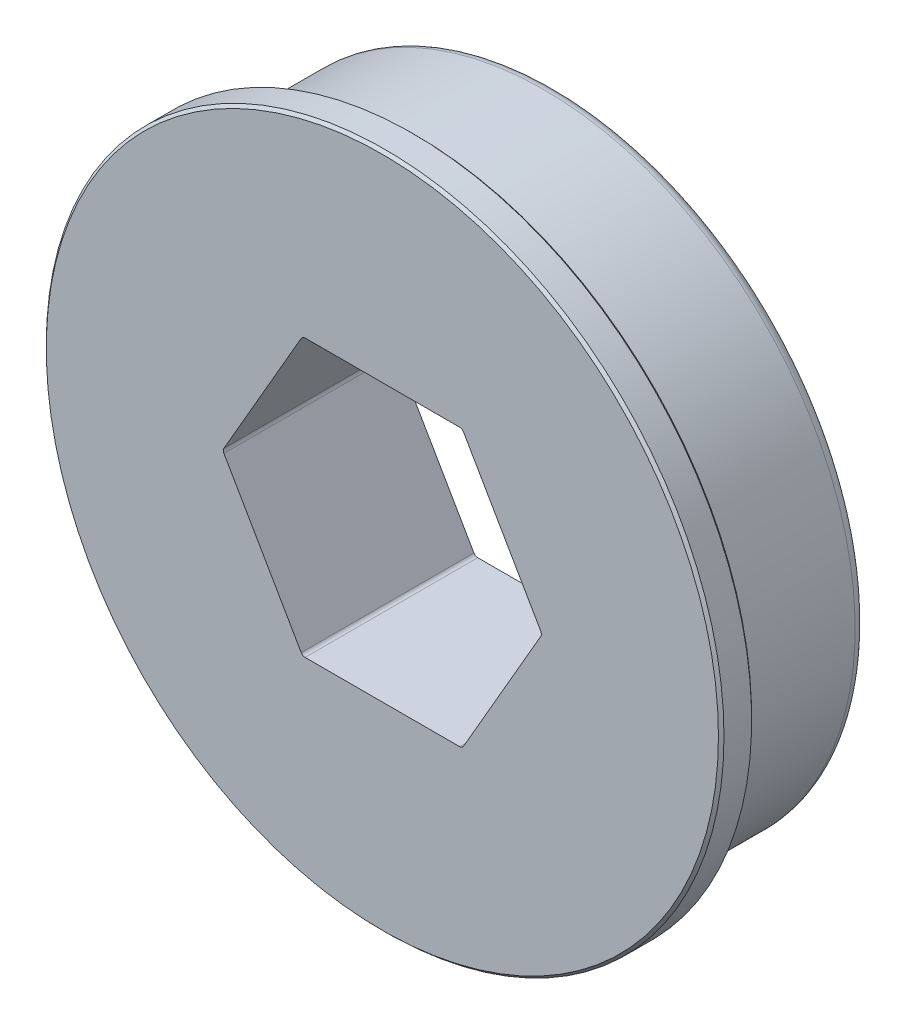
ISO-10303-21;
HEADER;
FILE_DESCRIPTION(('STEP AP214'),'2;1');
FILE_NAME('part.step','',(''),(''),'','','');
FILE_SCHEMA(('AUTOMOTIVE_DESIGN { 1 0 10303 214 1 1 1 1 }'));
ENDSEC;
DATA;
#1=APPLICATION_CONTEXT('core data for automotive mechanical design processes');
#2=APPLICATION_PROTOCOL_DEFINITION('international standard','automotive_design',2000,#1);
#3=PRODUCT_CONTEXT('',#1,'mechanical');
#4=PRODUCT('Part','Part','',(#3));
#5=PRODUCT_RELATED_PRODUCT_CATEGORY('part','',(#4));
#6=PRODUCT_DEFINITION_FORMATION('','',#4);
#7=PRODUCT_DEFINITION_CONTEXT('part definition',#1,'design');
#8=PRODUCT_DEFINITION('design','',#6,#7);
#9=PRODUCT_DEFINITION_SHAPE('','',#8);
#10=(LENGTH_UNIT() NAMED_UNIT(*) SI_UNIT(.MILLI.,.METRE.));
#11=(NAMED_UNIT(*) PLANE_ANGLE_UNIT() SI_UNIT($,.RADIAN.));
#12=(NAMED_UNIT(*) SI_UNIT($,.STERADIAN.) SOLID_ANGLE_UNIT());
#13=UNCERTAINTY_MEASURE_WITH_UNIT(LENGTH_MEASURE(1.E-05),#10,'distance_accuracy_value','');
#14=(GEOMETRIC_REPRESENTATION_CONTEXT(3) GLOBAL_UNCERTAINTY_ASSIGNED_CONTEXT((#13)) GLOBAL_UNIT_ASSIGNED_CONTEXT((#10,
#11,#12)) REPRESENTATION_CONTEXT('',''));
#15=CARTESIAN_POINT('',(0.,0.,0.));
#16=DIRECTION('',(0.,0.,1.));
#17=DIRECTION('',(1.,0.,0.));
#18=AXIS2_PLACEMENT_3D('',#15,#16,#17);
#19=CARTESIAN_POINT('',(0.,0.,7.92734));
#20=DIRECTION('',(0.,0.,-1.));
#21=DIRECTION('',(-1.,0.,0.));
#22=AXIS2_PLACEMENT_3D('',#19,#20,#21);
#23=CYLINDRICAL_SURFACE('',#22,15.5575);
#24=CARTESIAN_POINT('',(0.,0.,7.80034));
#25=DIRECTION('',(0.,0.,1.));
#26=DIRECTION('',(1.,0.,0.));
#27=AXIS2_PLACEMENT_3D('',#24,#25,#26);
#28=CIRCLE('',#27,15.5575);
#29=CARTESIAN_POINT('',(15.5575,0.,7.80034));
#30=VERTEX_POINT('',#29);
#31=EDGE_CURVE('E176',#30,#30,#28,.F.);
#32=ORIENTED_EDGE('',*,*,#31,.T.);
#33=EDGE_LOOP('',(#32));
#34=FACE_BOUND('',#33,.T.);
#35=CARTESIAN_POINT('',(0.,0.,6.53034000000001));
#36=DIRECTION('',(0.,0.,-1.));
#37=DIRECTION('',(-1.,0.,0.));
#38=AXIS2_PLACEMENT_3D('',#35,#36,#37);
#39=CIRCLE('',#38,15.5575);
#40=CARTESIAN_POINT('',(-15.5575,0.,6.53034000000001));
#41=VERTEX_POINT('',#40);
#42=EDGE_CURVE('E173',#41,#41,#39,.F.);
#43=ORIENTED_EDGE('',*,*,#42,.T.);
#44=EDGE_LOOP('',(#43));
#45=FACE_BOUND('',#44,.T.);
#46=ADVANCED_FACE('F37',(#34,#45),#23,.T.);
#47=CARTESIAN_POINT('',(15.5575,0.,7.92734));
#48=DIRECTION('',(0.,0.,1.));
#49=DIRECTION('',(1.,0.,0.));
#50=AXIS2_PLACEMENT_3D('',#47,#48,#49);
#51=PLANE('',#50);
#52=CARTESIAN_POINT('',(0.,0.,7.92734));
#53=DIRECTION('',(0.,0.,1.));
#54=DIRECTION('',(1.,0.,0.));
#55=AXIS2_PLACEMENT_3D('',#52,#53,#54);
#56=CIRCLE('',#55,15.4305);
#57=CARTESIAN_POINT('',(15.4305,0.,7.92734));
#58=VERTEX_POINT('',#57);
#59=EDGE_CURVE('E179',#58,#58,#56,.T.);
#60=ORIENTED_EDGE('',*,*,#59,.T.);
#61=EDGE_LOOP('',(#60));
#62=FACE_BOUND('',#61,.T.);
#63=DIRECTION('',(-0.5,0.866025403784439,0.));
#64=VECTOR('',#63,1.);
#65=CARTESIAN_POINT('',(-3.66617420935412,-6.35,7.92734));
#66=LINE('',#65,#64);
#67=CARTESIAN_POINT('',(-3.72483299670378,-6.2484,7.92734));
#68=VERTEX_POINT('',#67);
#69=CARTESIAN_POINT('',(-7.27368963135857,-0.101599999999999,7.92734));
#70=VERTEX_POINT('',#69);
#71=EDGE_CURVE('E148',#68,#70,#66,.T.);
#72=ORIENTED_EDGE('',*,*,#71,.T.);
#73=CARTESIAN_POINT('',(-7.09771326930957,0.,7.92734));
#74=DIRECTION('',(0.,0.,1.));
#75=DIRECTION('',(1.,0.,0.));
#76=AXIS2_PLACEMENT_3D('',#73,#74,#75);
#77=CIRCLE('',#76,0.2032);
#78=CARTESIAN_POINT('',(-7.27368963135857,0.101599999999999,7.92734));
#79=VERTEX_POINT('',#78);
#80=EDGE_CURVE('E213',#70,#79,#77,.F.);
#81=ORIENTED_EDGE('',*,*,#80,.T.);
#82=DIRECTION('',(0.5,0.866025403784439,0.));
#83=VECTOR('',#82,1.);
#84=CARTESIAN_POINT('',(-7.33234841870824,0.,7.92734));
#85=LINE('',#84,#83);
#86=CARTESIAN_POINT('',(-3.72483299670378,6.2484,7.92734));
#87=VERTEX_POINT('',#86);
#88=EDGE_CURVE('E155',#79,#87,#85,.T.);
#89=ORIENTED_EDGE('',*,*,#88,.T.);
#90=CARTESIAN_POINT('',(-3.54885663465478,6.1468,7.92734));
#91=DIRECTION('',(0.,0.,1.));
#92=DIRECTION('',(1.,0.,0.));
#93=AXIS2_PLACEMENT_3D('',#90,#91,#92);
#94=CIRCLE('',#93,0.2032);
#95=CARTESIAN_POINT('',(-3.54885663465478,6.35,7.92734));
#96=VERTEX_POINT('',#95);
#97=EDGE_CURVE('E59',#87,#96,#94,.F.);
#98=ORIENTED_EDGE('',*,*,#97,.T.);
#99=DIRECTION('',(1.,0.,0.));
#100=VECTOR('',#99,1.);
#101=CARTESIAN_POINT('',(-3.66617420935411,6.35,7.92734));
#102=LINE('',#101,#100);
#103=CARTESIAN_POINT('',(3.5488566346548,6.35,7.92734));
#104=VERTEX_POINT('',#103);
#105=EDGE_CURVE('E158',#96,#104,#102,.T.);
#106=ORIENTED_EDGE('',*,*,#105,.T.);
#107=CARTESIAN_POINT('',(3.5488566346548,6.1468,7.92734));
#108=DIRECTION('',(0.,0.,1.));
#109=DIRECTION('',(1.,0.,0.));
#110=AXIS2_PLACEMENT_3D('',#107,#108,#109);
#111=CIRCLE('',#110,0.2032);
#112=CARTESIAN_POINT('',(3.7248329967038,6.2484,7.92734));
#113=VERTEX_POINT('',#112);
#114=EDGE_CURVE('E224',#104,#113,#111,.F.);
#115=ORIENTED_EDGE('',*,*,#114,.T.);
#116=DIRECTION('',(0.5,-0.866025403784439,0.));
#117=VECTOR('',#116,1.);
#118=CARTESIAN_POINT('',(3.66617420935413,6.35,7.92734));
#119=LINE('',#118,#117);
#120=CARTESIAN_POINT('',(7.27368963135859,0.101599999999992,7.92734));
#121=VERTEX_POINT('',#120);
#122=EDGE_CURVE('E290',#113,#121,#119,.T.);
#123=ORIENTED_EDGE('',*,*,#122,.T.);
#124=CARTESIAN_POINT('',(7.09771326930959,0.,7.92734));
#125=DIRECTION('',(0.,0.,1.));
#126=DIRECTION('',(1.,0.,0.));
#127=AXIS2_PLACEMENT_3D('',#124,#125,#126);
#128=CIRCLE('',#127,0.2032);
#129=CARTESIAN_POINT('',(7.27368963135859,-0.101600000000009,7.92734));
#130=VERTEX_POINT('',#129);
#131=EDGE_CURVE('E210',#121,#130,#128,.F.);
#132=ORIENTED_EDGE('',*,*,#131,.T.);
#133=DIRECTION('',(-0.5,-0.866025403784439,0.));
#134=VECTOR('',#133,1.);
#135=CARTESIAN_POINT('',(7.33234841870826,0.,7.92734));
#136=LINE('',#135,#134);
#137=CARTESIAN_POINT('',(3.72483299670381,-6.2484,7.92734));
#138=VERTEX_POINT('',#137);
#139=EDGE_CURVE('E285',#130,#138,#136,.T.);
#140=ORIENTED_EDGE('',*,*,#139,.T.);
#141=CARTESIAN_POINT('',(3.54885663465481,-6.1468,7.92734));
#142=DIRECTION('',(0.,0.,1.));
#143=DIRECTION('',(1.,0.,0.));
#144=AXIS2_PLACEMENT_3D('',#141,#142,#143);
#145=CIRCLE('',#144,0.2032);
#146=CARTESIAN_POINT('',(3.54885663465481,-6.35,7.92734));
#147=VERTEX_POINT('',#146);
#148=EDGE_CURVE('E220',#138,#147,#145,.F.);
#149=ORIENTED_EDGE('',*,*,#148,.T.);
#150=DIRECTION('',(-1.,0.,0.));
#151=VECTOR('',#150,1.);
#152=CARTESIAN_POINT('',(3.66617420935414,-6.35,7.92734));
#153=LINE('',#152,#151);
#154=CARTESIAN_POINT('',(-3.54885663465478,-6.35,7.92734));
#155=VERTEX_POINT('',#154);
#156=EDGE_CURVE('E283',#147,#155,#153,.T.);
#157=ORIENTED_EDGE('',*,*,#156,.T.);
#158=CARTESIAN_POINT('',(-3.54885663465478,-6.1468,7.92734));
#159=DIRECTION('',(0.,0.,1.));
#160=DIRECTION('',(1.,0.,0.));
#161=AXIS2_PLACEMENT_3D('',#158,#159,#160);
#162=CIRCLE('',#161,0.2032);
#163=EDGE_CURVE('E138',#155,#68,#162,.F.);
#164=ORIENTED_EDGE('',*,*,#163,.T.);
#165=EDGE_LOOP('',(#72,#81,#89,#98,#106,#115,#123,#132,#140,#149,#157,#164));
#166=FACE_BOUND('',#165,.T.);
#167=ADVANCED_FACE('F239',(#62,#166),#51,.T.);
#168=CARTESIAN_POINT('',(0.,0.,0.));
#169=DIRECTION('',(0.,0.,-1.));
#170=DIRECTION('',(-1.,0.,0.));
#171=AXIS2_PLACEMENT_3D('',#168,#169,#170);
#172=PLANE('',#171);
#173=CARTESIAN_POINT('',(0.,0.,0.));
#174=DIRECTION('',(0.,0.,-1.));
#175=DIRECTION('',(-1.,0.,0.));
#176=AXIS2_PLACEMENT_3D('',#173,#174,#175);
#177=CIRCLE('',#176,13.7795);
#178=CARTESIAN_POINT('',(-13.7795,0.,0.));
#179=VERTEX_POINT('',#178);
#180=EDGE_CURVE('E45',#179,#179,#177,.T.);
#181=ORIENTED_EDGE('',*,*,#180,.T.);
#182=EDGE_LOOP('',(#181));
#183=FACE_BOUND('',#182,.T.);
#184=DIRECTION('',(0.5,0.866025403784439,0.));
#185=VECTOR('',#184,1.);
#186=CARTESIAN_POINT('',(-7.33234841870824,0.,0.));
#187=LINE('',#186,#185);
#188=CARTESIAN_POINT('',(-7.27368963135857,0.101599999999999,0.));
#189=VERTEX_POINT('',#188);
#190=CARTESIAN_POINT('',(-3.72483299670378,6.2484,0.));
#191=VERTEX_POINT('',#190);
#192=EDGE_CURVE('E294',#189,#191,#187,.T.);
#193=ORIENTED_EDGE('',*,*,#192,.F.);
#194=CARTESIAN_POINT('',(-7.09771326930957,0.,0.));
#195=DIRECTION('',(0.,0.,-1.));
#196=DIRECTION('',(-1.,0.,0.));
#197=AXIS2_PLACEMENT_3D('',#194,#195,#196);
#198=CIRCLE('',#197,0.2032);
#199=CARTESIAN_POINT('',(-7.27368963135857,-0.101599999999999,0.));
#200=VERTEX_POINT('',#199);
#201=EDGE_CURVE('E154',#189,#200,#198,.F.);
#202=ORIENTED_EDGE('',*,*,#201,.T.);
#203=DIRECTION('',(-0.5,0.866025403784439,0.));
#204=VECTOR('',#203,1.);
#205=CARTESIAN_POINT('',(-3.66617420935412,-6.35,0.));
#206=LINE('',#205,#204);
#207=CARTESIAN_POINT('',(-3.72483299670378,-6.2484,0.));
#208=VERTEX_POINT('',#207);
#209=EDGE_CURVE('E145',#208,#200,#206,.T.);
#210=ORIENTED_EDGE('',*,*,#209,.F.);
#211=CARTESIAN_POINT('',(-3.54885663465478,-6.1468,0.));
#212=DIRECTION('',(0.,0.,-1.));
#213=DIRECTION('',(-1.,0.,0.));
#214=AXIS2_PLACEMENT_3D('',#211,#212,#213);
#215=CIRCLE('',#214,0.2032);
#216=CARTESIAN_POINT('',(-3.54885663465478,-6.35,0.));
#217=VERTEX_POINT('',#216);
#218=EDGE_CURVE('E128',#208,#217,#215,.F.);
#219=ORIENTED_EDGE('',*,*,#218,.T.);
#220=DIRECTION('',(-1.,0.,0.));
#221=VECTOR('',#220,1.);
#222=CARTESIAN_POINT('',(3.66617420935414,-6.35,0.));
#223=LINE('',#222,#221);
#224=CARTESIAN_POINT('',(3.54885663465481,-6.35,0.));
#225=VERTEX_POINT('',#224);
#226=EDGE_CURVE('E156',#225,#217,#223,.T.);
#227=ORIENTED_EDGE('',*,*,#226,.F.);
#228=CARTESIAN_POINT('',(3.54885663465481,-6.1468,0.));
#229=DIRECTION('',(0.,0.,-1.));
#230=DIRECTION('',(-1.,0.,0.));
#231=AXIS2_PLACEMENT_3D('',#228,#229,#230);
#232=CIRCLE('',#231,0.2032);
#233=CARTESIAN_POINT('',(3.72483299670381,-6.2484,0.));
#234=VERTEX_POINT('',#233);
#235=EDGE_CURVE('E218',#225,#234,#232,.F.);
#236=ORIENTED_EDGE('',*,*,#235,.T.);
#237=DIRECTION('',(-0.5,-0.866025403784439,0.));
#238=VECTOR('',#237,1.);
#239=CARTESIAN_POINT('',(7.33234841870826,0.,0.));
#240=LINE('',#239,#238);
#241=CARTESIAN_POINT('',(7.27368963135859,-0.101600000000009,0.));
#242=VERTEX_POINT('',#241);
#243=EDGE_CURVE('E160',#242,#234,#240,.T.);
#244=ORIENTED_EDGE('',*,*,#243,.F.);
#245=CARTESIAN_POINT('',(7.09771326930959,0.,0.));
#246=DIRECTION('',(0.,0.,-1.));
#247=DIRECTION('',(-1.,0.,0.));
#248=AXIS2_PLACEMENT_3D('',#245,#246,#247);
#249=CIRCLE('',#248,0.2032);
#250=CARTESIAN_POINT('',(7.27368963135859,0.101599999999992,0.));
#251=VERTEX_POINT('',#250);
#252=EDGE_CURVE('E208',#242,#251,#249,.F.);
#253=ORIENTED_EDGE('',*,*,#252,.T.);
#254=DIRECTION('',(0.5,-0.866025403784439,0.));
#255=VECTOR('',#254,1.);
#256=CARTESIAN_POINT('',(3.66617420935413,6.35,0.));
#257=LINE('',#256,#255);
#258=CARTESIAN_POINT('',(3.7248329967038,6.2484,0.));
#259=VERTEX_POINT('',#258);
#260=EDGE_CURVE('E299',#259,#251,#257,.T.);
#261=ORIENTED_EDGE('',*,*,#260,.F.);
#262=CARTESIAN_POINT('',(3.5488566346548,6.1468,0.));
#263=DIRECTION('',(0.,0.,-1.));
#264=DIRECTION('',(-1.,0.,0.));
#265=AXIS2_PLACEMENT_3D('',#262,#263,#264);
#266=CIRCLE('',#265,0.2032);
#267=CARTESIAN_POINT('',(3.5488566346548,6.35,0.));
#268=VERTEX_POINT('',#267);
#269=EDGE_CURVE('E222',#259,#268,#266,.F.);
#270=ORIENTED_EDGE('',*,*,#269,.T.);
#271=DIRECTION('',(1.,0.,0.));
#272=VECTOR('',#271,1.);
#273=CARTESIAN_POINT('',(-3.66617420935411,6.35,0.));
#274=LINE('',#273,#272);
#275=CARTESIAN_POINT('',(-3.54885663465478,6.35,0.));
#276=VERTEX_POINT('',#275);
#277=EDGE_CURVE('E297',#276,#268,#274,.T.);
#278=ORIENTED_EDGE('',*,*,#277,.F.);
#279=CARTESIAN_POINT('',(-3.54885663465478,6.1468,0.));
#280=DIRECTION('',(0.,0.,-1.));
#281=DIRECTION('',(-1.,0.,0.));
#282=AXIS2_PLACEMENT_3D('',#279,#280,#281);
#283=CIRCLE('',#282,0.2032);
#284=EDGE_CURVE('E215',#276,#191,#283,.F.);
#285=ORIENTED_EDGE('',*,*,#284,.T.);
#286=EDGE_LOOP('',(#193,#202,#210,#219,#227,#236,#244,#253,#261,#270,#278,#285));
#287=FACE_BOUND('',#286,.T.);
#288=ADVANCED_FACE('F153',(#183,#287),#172,.T.);
#289=CARTESIAN_POINT('',(0.,0.,7.92734));
#290=DIRECTION('',(0.,0.,-1.));
#291=DIRECTION('',(-1.,0.,0.));
#292=AXIS2_PLACEMENT_3D('',#289,#290,#291);
#293=CYLINDRICAL_SURFACE('',#292,14.2875);
#294=CARTESIAN_POINT('',(0.,0.,0.508));
#295=DIRECTION('',(0.,0.,-1.));
#296=DIRECTION('',(-1.,0.,0.));
#297=AXIS2_PLACEMENT_3D('',#294,#295,#296);
#298=CIRCLE('',#297,14.2875);
#299=CARTESIAN_POINT('',(-14.2875,0.,0.508));
#300=VERTEX_POINT('',#299);
#301=EDGE_CURVE('E11',#300,#300,#298,.F.);
#302=ORIENTED_EDGE('',*,*,#301,.T.);
#303=EDGE_LOOP('',(#302));
#304=FACE_BOUND('',#303,.T.);
#305=CARTESIAN_POINT('',(0.,0.,5.89534));
#306=DIRECTION('',(0.,0.,-1.));
#307=DIRECTION('',(-1.,0.,0.));
#308=AXIS2_PLACEMENT_3D('',#305,#306,#307);
#309=CIRCLE('',#308,14.2875);
#310=CARTESIAN_POINT('',(-14.2875,0.,5.89534));
#311=VERTEX_POINT('',#310);
#312=EDGE_CURVE('E170',#311,#311,#309,.T.);
#313=ORIENTED_EDGE('',*,*,#312,.T.);
#314=EDGE_LOOP('',(#313));
#315=FACE_BOUND('',#314,.T.);
#316=ADVANCED_FACE('F344',(#304,#315),#293,.T.);
#317=CARTESIAN_POINT('',(14.2875,0.,5.89534));
#318=DIRECTION('',(0.,0.,1.));
#319=DIRECTION('',(1.,0.,0.));
#320=AXIS2_PLACEMENT_3D('',#317,#318,#319);
#321=PLANE('',#320);
#322=CARTESIAN_POINT('',(0.,0.,5.89534));
#323=DIRECTION('',(0.,0.,-1.));
#324=DIRECTION('',(-1.,0.,0.));
#325=AXIS2_PLACEMENT_3D('',#322,#323,#324);
#326=CIRCLE('',#325,13.97);
#327=CARTESIAN_POINT('',(-13.97,0.,5.89534));
#328=VERTEX_POINT('',#327);
#329=EDGE_CURVE('E167',#328,#328,#326,.T.);
#330=ORIENTED_EDGE('',*,*,#329,.T.);
#331=EDGE_LOOP('',(#330));
#332=FACE_BOUND('',#331,.T.);
#333=ORIENTED_EDGE('',*,*,#312,.F.);
#334=EDGE_LOOP('',(#333));
#335=FACE_BOUND('',#334,.T.);
#336=ADVANCED_FACE('F340',(#332,#335),#321,.T.);
#337=CARTESIAN_POINT('',(0.,0.,7.92734));
#338=DIRECTION('',(0.,0.,-1.));
#339=DIRECTION('',(-1.,0.,0.));
#340=AXIS2_PLACEMENT_3D('',#337,#338,#339);
#341=CYLINDRICAL_SURFACE('',#340,13.97);
#342=CARTESIAN_POINT('',(0.,0.,6.40334));
#343=DIRECTION('',(0.,0.,-1.));
#344=DIRECTION('',(-1.,0.,0.));
#345=AXIS2_PLACEMENT_3D('',#342,#343,#344);
#346=CIRCLE('',#345,13.97);
#347=CARTESIAN_POINT('',(-13.97,0.,6.40334));
#348=VERTEX_POINT('',#347);
#349=EDGE_CURVE('E164',#348,#348,#346,.T.);
#350=ORIENTED_EDGE('',*,*,#349,.T.);
#351=EDGE_LOOP('',(#350));
#352=FACE_BOUND('',#351,.T.);
#353=ORIENTED_EDGE('',*,*,#329,.F.);
#354=EDGE_LOOP('',(#353));
#355=FACE_BOUND('',#354,.T.);
#356=ADVANCED_FACE('F332',(#352,#355),#341,.T.);
#357=CARTESIAN_POINT('',(13.97,0.,6.40334));
#358=DIRECTION('',(0.,0.,-1.));
#359=DIRECTION('',(-1.,0.,0.));
#360=AXIS2_PLACEMENT_3D('',#357,#358,#359);
#361=PLANE('',#360);
#362=CARTESIAN_POINT('',(0.,0.,6.40334));
#363=DIRECTION('',(0.,0.,-1.));
#364=DIRECTION('',(-1.,0.,0.));
#365=AXIS2_PLACEMENT_3D('',#362,#363,#364);
#366=CIRCLE('',#365,15.4305);
#367=CARTESIAN_POINT('',(-15.4305,0.,6.40334));
#368=VERTEX_POINT('',#367);
#369=EDGE_CURVE('E182',#368,#368,#366,.T.);
#370=ORIENTED_EDGE('',*,*,#369,.T.);
#371=EDGE_LOOP('',(#370));
#372=FACE_BOUND('',#371,.T.);
#373=ORIENTED_EDGE('',*,*,#349,.F.);
#374=EDGE_LOOP('',(#373));
#375=FACE_BOUND('',#374,.T.);
#376=ADVANCED_FACE('F325',(#372,#375),#361,.T.);
#377=CARTESIAN_POINT('',(-7.33234841870824,0.,7.92734));
#378=DIRECTION('',(-0.866025403784439,0.5,0.));
#379=DIRECTION('',(-0.5,-0.866025403784439,0.));
#380=AXIS2_PLACEMENT_3D('',#377,#378,#379);
#381=PLANE('',#380);
#382=ORIENTED_EDGE('',*,*,#88,.F.);
#383=DIRECTION('',(0.,0.,-1.));
#384=VECTOR('',#383,1.);
#385=CARTESIAN_POINT('',(-7.27368963135857,0.101599999999999,0.));
#386=LINE('',#385,#384);
#387=EDGE_CURVE('E201',#79,#189,#386,.T.);
#388=ORIENTED_EDGE('',*,*,#387,.T.);
#389=ORIENTED_EDGE('',*,*,#192,.T.);
#390=DIRECTION('',(0.,0.,-1.));
#391=VECTOR('',#390,1.);
#392=CARTESIAN_POINT('',(-3.72483299670378,6.2484,7.92734));
#393=LINE('',#392,#391);
#394=EDGE_CURVE('E199',#191,#87,#393,.F.);
#395=ORIENTED_EDGE('',*,*,#394,.T.);
#396=EDGE_LOOP('',(#382,#388,#389,#395));
#397=FACE_BOUND('',#396,.T.);
#398=ADVANCED_FACE('F321',(#397),#381,.F.);
#399=CARTESIAN_POINT('',(-3.66617420935412,-6.35,7.92734));
#400=DIRECTION('',(-0.866025403784439,-0.5,0.));
#401=DIRECTION('',(0.5,-0.866025403784439,0.));
#402=AXIS2_PLACEMENT_3D('',#399,#400,#401);
#403=PLANE('',#402);
#404=ORIENTED_EDGE('',*,*,#71,.F.);
#405=DIRECTION('',(0.,0.,-1.));
#406=VECTOR('',#405,1.);
#407=CARTESIAN_POINT('',(-3.72483299670378,-6.2484,0.));
#408=LINE('',#407,#406);
#409=EDGE_CURVE('E132',#68,#208,#408,.T.);
#410=ORIENTED_EDGE('',*,*,#409,.T.);
#411=ORIENTED_EDGE('',*,*,#209,.T.);
#412=DIRECTION('',(0.,0.,-1.));
#413=VECTOR('',#412,1.);
#414=CARTESIAN_POINT('',(-7.27368963135857,-0.101600000000001,7.92734));
#415=LINE('',#414,#413);
#416=EDGE_CURVE('E150',#200,#70,#415,.F.);
#417=ORIENTED_EDGE('',*,*,#416,.T.);
#418=EDGE_LOOP('',(#404,#410,#411,#417));
#419=FACE_BOUND('',#418,.T.);
#420=ADVANCED_FACE('F144',(#419),#403,.F.);
#421=CARTESIAN_POINT('',(3.66617420935414,-6.35,7.92734));
#422=DIRECTION('',(0.,-1.,0.));
#423=DIRECTION('',(0.,0.,-1.));
#424=AXIS2_PLACEMENT_3D('',#421,#422,#423);
#425=PLANE('',#424);
#426=ORIENTED_EDGE('',*,*,#226,.T.);
#427=DIRECTION('',(0.,0.,-1.));
#428=VECTOR('',#427,1.);
#429=CARTESIAN_POINT('',(-3.54885663465478,-6.35,7.92734));
#430=LINE('',#429,#428);
#431=EDGE_CURVE('E133',#217,#155,#430,.F.);
#432=ORIENTED_EDGE('',*,*,#431,.T.);
#433=ORIENTED_EDGE('',*,*,#156,.F.);
#434=DIRECTION('',(0.,0.,-1.));
#435=VECTOR('',#434,1.);
#436=CARTESIAN_POINT('',(3.54885663465481,-6.35,0.));
#437=LINE('',#436,#435);
#438=EDGE_CURVE('E149',#147,#225,#437,.T.);
#439=ORIENTED_EDGE('',*,*,#438,.T.);
#440=EDGE_LOOP('',(#426,#432,#433,#439));
#441=FACE_BOUND('',#440,.T.);
#442=ADVANCED_FACE('F287',(#441),#425,.F.);
#443=CARTESIAN_POINT('',(7.33234841870826,0.,7.92734));
#444=DIRECTION('',(0.866025403784439,-0.5,0.));
#445=DIRECTION('',(0.5,0.866025403784439,0.));
#446=AXIS2_PLACEMENT_3D('',#443,#444,#445);
#447=PLANE('',#446);
#448=ORIENTED_EDGE('',*,*,#139,.F.);
#449=DIRECTION('',(0.,0.,-1.));
#450=VECTOR('',#449,1.);
#451=CARTESIAN_POINT('',(7.27368963135859,-0.101600000000009,0.));
#452=LINE('',#451,#450);
#453=EDGE_CURVE('E191',#130,#242,#452,.T.);
#454=ORIENTED_EDGE('',*,*,#453,.T.);
#455=ORIENTED_EDGE('',*,*,#243,.T.);
#456=DIRECTION('',(0.,0.,-1.));
#457=VECTOR('',#456,1.);
#458=CARTESIAN_POINT('',(3.72483299670381,-6.2484,7.92734));
#459=LINE('',#458,#457);
#460=EDGE_CURVE('E189',#234,#138,#459,.F.);
#461=ORIENTED_EDGE('',*,*,#460,.T.);
#462=EDGE_LOOP('',(#448,#454,#455,#461));
#463=FACE_BOUND('',#462,.T.);
#464=ADVANCED_FACE('F304',(#463),#447,.F.);
#465=CARTESIAN_POINT('',(3.66617420935413,6.35,7.92734));
#466=DIRECTION('',(0.866025403784439,0.5,0.));
#467=DIRECTION('',(-0.5,0.866025403784439,0.));
#468=AXIS2_PLACEMENT_3D('',#465,#466,#467);
#469=PLANE('',#468);
#470=ORIENTED_EDGE('',*,*,#260,.T.);
#471=DIRECTION('',(0.,0.,-1.));
#472=VECTOR('',#471,1.);
#473=CARTESIAN_POINT('',(7.27368963135859,0.101599999999991,7.92734));
#474=LINE('',#473,#472);
#475=EDGE_CURVE('E197',#251,#121,#474,.F.);
#476=ORIENTED_EDGE('',*,*,#475,.T.);
#477=ORIENTED_EDGE('',*,*,#122,.F.);
#478=DIRECTION('',(0.,0.,-1.));
#479=VECTOR('',#478,1.);
#480=CARTESIAN_POINT('',(3.7248329967038,6.2484,0.));
#481=LINE('',#480,#479);
#482=EDGE_CURVE('E194',#113,#259,#481,.T.);
#483=ORIENTED_EDGE('',*,*,#482,.T.);
#484=EDGE_LOOP('',(#470,#476,#477,#483));
#485=FACE_BOUND('',#484,.T.);
#486=ADVANCED_FACE('F309',(#485),#469,.F.);
#487=CARTESIAN_POINT('',(-3.66617420935411,6.35,7.92734));
#488=DIRECTION('',(0.,1.,0.));
#489=DIRECTION('',(0.,0.,1.));
#490=AXIS2_PLACEMENT_3D('',#487,#488,#489);
#491=PLANE('',#490);
#492=ORIENTED_EDGE('',*,*,#105,.F.);
#493=DIRECTION('',(0.,0.,-1.));
#494=VECTOR('',#493,1.);
#495=CARTESIAN_POINT('',(-3.54885663465478,6.35,0.));
#496=LINE('',#495,#494);
#497=EDGE_CURVE('E139',#96,#276,#496,.T.);
#498=ORIENTED_EDGE('',*,*,#497,.T.);
#499=ORIENTED_EDGE('',*,*,#277,.T.);
#500=DIRECTION('',(0.,0.,-1.));
#501=VECTOR('',#500,1.);
#502=CARTESIAN_POINT('',(3.5488566346548,6.35,7.92734));
#503=LINE('',#502,#501);
#504=EDGE_CURVE('E52',#268,#104,#503,.F.);
#505=ORIENTED_EDGE('',*,*,#504,.T.);
#506=EDGE_LOOP('',(#492,#498,#499,#505));
#507=FACE_BOUND('',#506,.T.);
#508=ADVANCED_FACE('F254',(#507),#491,.F.);
#509=CARTESIAN_POINT('',(0.,0.,7.80034));
#510=DIRECTION('',(0.,0.,-1.));
#511=DIRECTION('',(-1.,0.,0.));
#512=AXIS2_PLACEMENT_3D('',#509,#510,#511);
#513=CONICAL_SURFACE('',#512,15.5575,0.785398163397455);
#514=ORIENTED_EDGE('',*,*,#59,.F.);
#515=EDGE_LOOP('',(#514));
#516=FACE_BOUND('',#515,.T.);
#517=ORIENTED_EDGE('',*,*,#31,.F.);
#518=EDGE_LOOP('',(#517));
#519=FACE_BOUND('',#518,.T.);
#520=ADVANCED_FACE('F250',(#516,#519),#513,.T.);
#521=CARTESIAN_POINT('',(0.,0.,6.40334));
#522=DIRECTION('',(0.,0.,1.));
#523=DIRECTION('',(1.,0.,0.));
#524=AXIS2_PLACEMENT_3D('',#521,#522,#523);
#525=CONICAL_SURFACE('',#524,15.4305,0.785398163397414);
#526=ORIENTED_EDGE('',*,*,#42,.F.);
#527=EDGE_LOOP('',(#526));
#528=FACE_BOUND('',#527,.T.);
#529=ORIENTED_EDGE('',*,*,#369,.F.);
#530=EDGE_LOOP('',(#529));
#531=FACE_BOUND('',#530,.T.);
#532=ADVANCED_FACE('F253',(#528,#531),#525,.T.);
#533=CARTESIAN_POINT('',(-3.54885663465478,-6.1468,7.92734));
#534=DIRECTION('',(0.,0.,1.));
#535=DIRECTION('',(1.,0.,0.));
#536=AXIS2_PLACEMENT_3D('',#533,#534,#535);
#537=CYLINDRICAL_SURFACE('',#536,0.2032);
#538=ORIENTED_EDGE('',*,*,#163,.F.);
#539=ORIENTED_EDGE('',*,*,#431,.F.);
#540=ORIENTED_EDGE('',*,*,#218,.F.);
#541=ORIENTED_EDGE('',*,*,#409,.F.);
#542=EDGE_LOOP('',(#538,#539,#540,#541));
#543=FACE_BOUND('',#542,.T.);
#544=ADVANCED_FACE('F131',(#543),#537,.F.);
#545=CARTESIAN_POINT('',(7.09771326930959,0.,7.92734));
#546=DIRECTION('',(0.,0.,1.));
#547=DIRECTION('',(1.,0.,0.));
#548=AXIS2_PLACEMENT_3D('',#545,#546,#547);
#549=CYLINDRICAL_SURFACE('',#548,0.2032);
#550=ORIENTED_EDGE('',*,*,#131,.F.);
#551=ORIENTED_EDGE('',*,*,#475,.F.);
#552=ORIENTED_EDGE('',*,*,#252,.F.);
#553=ORIENTED_EDGE('',*,*,#453,.F.);
#554=EDGE_LOOP('',(#550,#551,#552,#553));
#555=FACE_BOUND('',#554,.T.);
#556=ADVANCED_FACE('F261',(#555),#549,.F.);
#557=CARTESIAN_POINT('',(-7.09771326930957,0.,7.92734));
#558=DIRECTION('',(0.,0.,1.));
#559=DIRECTION('',(1.,0.,0.));
#560=AXIS2_PLACEMENT_3D('',#557,#558,#559);
#561=CYLINDRICAL_SURFACE('',#560,0.2032);
#562=ORIENTED_EDGE('',*,*,#80,.F.);
#563=ORIENTED_EDGE('',*,*,#416,.F.);
#564=ORIENTED_EDGE('',*,*,#201,.F.);
#565=ORIENTED_EDGE('',*,*,#387,.F.);
#566=EDGE_LOOP('',(#562,#563,#564,#565));
#567=FACE_BOUND('',#566,.T.);
#568=ADVANCED_FACE('F264',(#567),#561,.F.);
#569=CARTESIAN_POINT('',(-3.54885663465478,6.1468,7.92734));
#570=DIRECTION('',(0.,0.,1.));
#571=DIRECTION('',(1.,0.,0.));
#572=AXIS2_PLACEMENT_3D('',#569,#570,#571);
#573=CYLINDRICAL_SURFACE('',#572,0.2032);
#574=ORIENTED_EDGE('',*,*,#97,.F.);
#575=ORIENTED_EDGE('',*,*,#394,.F.);
#576=ORIENTED_EDGE('',*,*,#284,.F.);
#577=ORIENTED_EDGE('',*,*,#497,.F.);
#578=EDGE_LOOP('',(#574,#575,#576,#577));
#579=FACE_BOUND('',#578,.T.);
#580=ADVANCED_FACE('F268',(#579),#573,.F.);
#581=CARTESIAN_POINT('',(3.54885663465481,-6.1468,7.92734));
#582=DIRECTION('',(0.,0.,1.));
#583=DIRECTION('',(1.,0.,0.));
#584=AXIS2_PLACEMENT_3D('',#581,#582,#583);
#585=CYLINDRICAL_SURFACE('',#584,0.2032);
#586=ORIENTED_EDGE('',*,*,#148,.F.);
#587=ORIENTED_EDGE('',*,*,#460,.F.);
#588=ORIENTED_EDGE('',*,*,#235,.F.);
#589=ORIENTED_EDGE('',*,*,#438,.F.);
#590=EDGE_LOOP('',(#586,#587,#588,#589));
#591=FACE_BOUND('',#590,.T.);
#592=ADVANCED_FACE('F235',(#591),#585,.F.);
#593=CARTESIAN_POINT('',(3.5488566346548,6.1468,7.92734));
#594=DIRECTION('',(0.,0.,1.));
#595=DIRECTION('',(1.,0.,0.));
#596=AXIS2_PLACEMENT_3D('',#593,#594,#595);
#597=CYLINDRICAL_SURFACE('',#596,0.2032);
#598=ORIENTED_EDGE('',*,*,#114,.F.);
#599=ORIENTED_EDGE('',*,*,#504,.F.);
#600=ORIENTED_EDGE('',*,*,#269,.F.);
#601=ORIENTED_EDGE('',*,*,#482,.F.);
#602=EDGE_LOOP('',(#598,#599,#600,#601));
#603=FACE_BOUND('',#602,.T.);
#604=ADVANCED_FACE('F230',(#603),#597,.F.);
#605=CARTESIAN_POINT('',(0.,0.,0.508));
#606=DIRECTION('',(0.,0.,-1.));
#607=DIRECTION('',(-1.,0.,0.));
#608=AXIS2_PLACEMENT_3D('',#605,#606,#607);
#609=TOROIDAL_SURFACE('',#608,13.7795,0.508);
#610=ORIENTED_EDGE('',*,*,#301,.F.);
#611=EDGE_LOOP('',(#610));
#612=FACE_BOUND('',#611,.T.);
#613=ORIENTED_EDGE('',*,*,#180,.F.);
#614=EDGE_LOOP('',(#613));
#615=FACE_BOUND('',#614,.T.);
#616=ADVANCED_FACE('F39',(#612,#615),#609,.T.);
#617=CLOSED_SHELL('',(#46,#167,#288,#316,#336,#356,#376,#398,#420,#442,#464,#486,#508,#520,#532,
#544,#556,#568,#580,#592,#604,#616));
#618=MANIFOLD_SOLID_BREP('B2',#617);
#619=ADVANCED_BREP_SHAPE_REPRESENTATION('',(#18,#618),#14);
#620=SHAPE_DEFINITION_REPRESENTATION(#9,#619);
ENDSEC;
END-ISO-10303-21;
